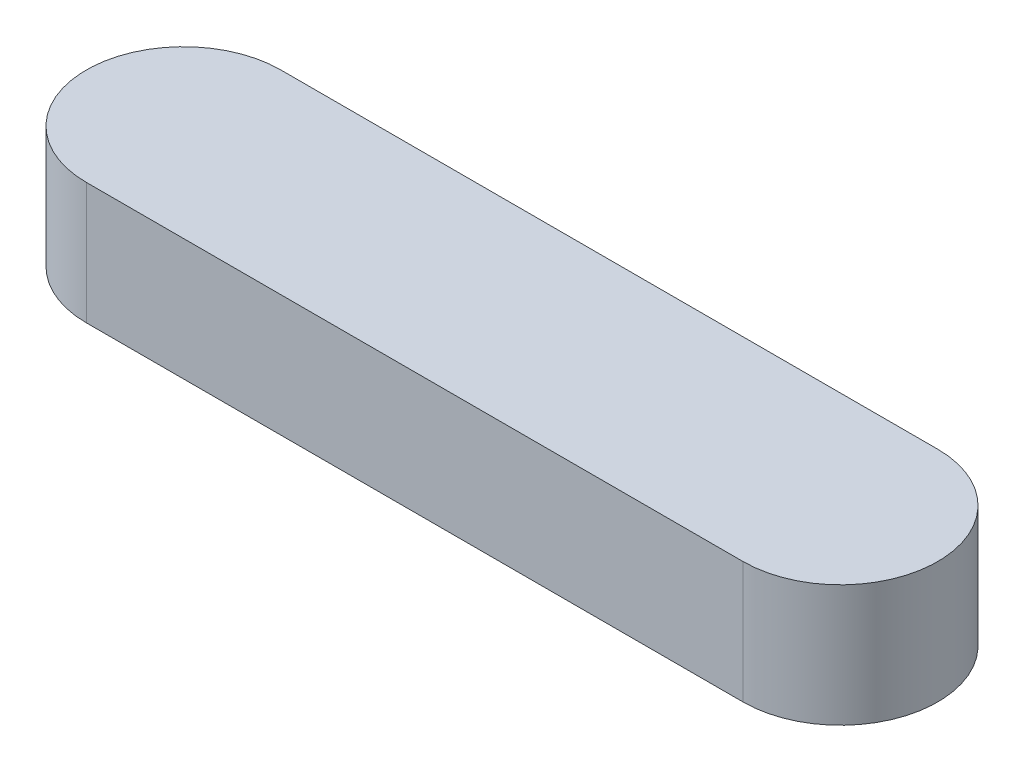
ISO-10303-21;
HEADER;
FILE_DESCRIPTION(('STEP AP214'),'2;1');
FILE_NAME('part.step','',(''),(''),'','','');
FILE_SCHEMA(('AUTOMOTIVE_DESIGN { 1 0 10303 214 1 1 1 1 }'));
ENDSEC;
DATA;
#1=APPLICATION_CONTEXT('core data for automotive mechanical design processes');
#2=APPLICATION_PROTOCOL_DEFINITION('international standard','automotive_design',2000,#1);
#3=PRODUCT_CONTEXT('',#1,'mechanical');
#4=PRODUCT('Part','Part','',(#3));
#5=PRODUCT_RELATED_PRODUCT_CATEGORY('part','',(#4));
#6=PRODUCT_DEFINITION_FORMATION('','',#4);
#7=PRODUCT_DEFINITION_CONTEXT('part definition',#1,'design');
#8=PRODUCT_DEFINITION('design','',#6,#7);
#9=PRODUCT_DEFINITION_SHAPE('','',#8);
#10=(LENGTH_UNIT() NAMED_UNIT(*) SI_UNIT(.MILLI.,.METRE.));
#11=(NAMED_UNIT(*) PLANE_ANGLE_UNIT() SI_UNIT($,.RADIAN.));
#12=(NAMED_UNIT(*) SI_UNIT($,.STERADIAN.) SOLID_ANGLE_UNIT());
#13=UNCERTAINTY_MEASURE_WITH_UNIT(LENGTH_MEASURE(1.E-05),#10,'distance_accuracy_value','');
#14=(GEOMETRIC_REPRESENTATION_CONTEXT(3) GLOBAL_UNCERTAINTY_ASSIGNED_CONTEXT((#13)) GLOBAL_UNIT_ASSIGNED_CONTEXT((#10,
#11,#12)) REPRESENTATION_CONTEXT('',''));
#15=CARTESIAN_POINT('',(0.,0.,0.));
#16=DIRECTION('',(0.,0.,1.));
#17=DIRECTION('',(1.,0.,0.));
#18=AXIS2_PLACEMENT_3D('',#15,#16,#17);
#19=CARTESIAN_POINT('',(-27.0000000000001,81.8052922840653,-3.05311331771918E-13));
#20=DIRECTION('',(0.,-1.,0.));
#21=DIRECTION('',(0.,0.,-1.));
#22=AXIS2_PLACEMENT_3D('',#19,#20,#21);
#23=CYLINDRICAL_SURFACE('',#22,8.);
#24=CARTESIAN_POINT('',(-27.,9.99999999999999,-3.05311331771918E-13));
#25=DIRECTION('',(0.,1.,0.));
#26=DIRECTION('',(0.,0.,1.));
#27=AXIS2_PLACEMENT_3D('',#24,#25,#26);
#28=CIRCLE('',#27,8.);
#29=CARTESIAN_POINT('',(-27.,10.0000000000001,-8.00000000000031));
#30=VERTEX_POINT('',#29);
#31=CARTESIAN_POINT('',(-27.,9.99999999999999,7.99999999999965));
#32=VERTEX_POINT('',#31);
#33=EDGE_CURVE('E94',#30,#32,#28,.T.);
#34=ORIENTED_EDGE('',*,*,#33,.F.);
#35=DIRECTION('',(0.,-1.,0.));
#36=VECTOR('',#35,1.);
#37=CARTESIAN_POINT('',(-27.0000000000001,81.8052922840653,-8.00000000000031));
#38=LINE('',#37,#36);
#39=CARTESIAN_POINT('',(-26.9999999999999,1.52655665885959E-13,-8.00000000000001));
#40=VERTEX_POINT('',#39);
#41=EDGE_CURVE('E48',#30,#40,#38,.T.);
#42=ORIENTED_EDGE('',*,*,#41,.T.);
#43=CARTESIAN_POINT('',(-26.9999999999999,1.52655665885959E-13,0.));
#44=DIRECTION('',(0.,1.,0.));
#45=DIRECTION('',(0.,0.,1.));
#46=AXIS2_PLACEMENT_3D('',#43,#44,#45);
#47=CIRCLE('',#46,8.);
#48=CARTESIAN_POINT('',(-26.9999999999999,0.,7.99999999999995));
#49=VERTEX_POINT('',#48);
#50=EDGE_CURVE('E92',#40,#49,#47,.T.);
#51=ORIENTED_EDGE('',*,*,#50,.T.);
#52=DIRECTION('',(0.,-1.,0.));
#53=VECTOR('',#52,1.);
#54=CARTESIAN_POINT('',(-27.0000000000001,81.8052922840653,7.9999999999997));
#55=LINE('',#54,#53);
#56=EDGE_CURVE('E83',#32,#49,#55,.T.);
#57=ORIENTED_EDGE('',*,*,#56,.F.);
#58=EDGE_LOOP('',(#34,#42,#51,#57));
#59=FACE_BOUND('',#58,.T.);
#60=ADVANCED_FACE('F44',(#59),#23,.T.);
#61=CARTESIAN_POINT('',(-27.0000000000001,81.8052922840653,7.9999999999997));
#62=DIRECTION('',(0.,0.,-1.));
#63=DIRECTION('',(-1.,0.,0.));
#64=AXIS2_PLACEMENT_3D('',#61,#62,#63);
#65=PLANE('',#64);
#66=DIRECTION('',(1.,0.,0.));
#67=VECTOR('',#66,1.);
#68=CARTESIAN_POINT('',(-27.,9.99999999999999,7.99999999999965));
#69=LINE('',#68,#67);
#70=CARTESIAN_POINT('',(26.9999999999999,9.99999999999999,7.99999999999965));
#71=VERTEX_POINT('',#70);
#72=EDGE_CURVE('E53',#32,#71,#69,.T.);
#73=ORIENTED_EDGE('',*,*,#72,.F.);
#74=ORIENTED_EDGE('',*,*,#56,.T.);
#75=DIRECTION('',(1.,0.,0.));
#76=VECTOR('',#75,1.);
#77=CARTESIAN_POINT('',(-26.9999999999999,0.,7.99999999999995));
#78=LINE('',#77,#76);
#79=CARTESIAN_POINT('',(26.9999999999999,0.,7.99999999999995));
#80=VERTEX_POINT('',#79);
#81=EDGE_CURVE('E104',#49,#80,#78,.T.);
#82=ORIENTED_EDGE('',*,*,#81,.T.);
#83=DIRECTION('',(0.,-1.,0.));
#84=VECTOR('',#83,1.);
#85=CARTESIAN_POINT('',(27.0000000000003,81.805292284065,7.9999999999997));
#86=LINE('',#85,#84);
#87=EDGE_CURVE('E113',#71,#80,#86,.T.);
#88=ORIENTED_EDGE('',*,*,#87,.F.);
#89=EDGE_LOOP('',(#73,#74,#82,#88));
#90=FACE_BOUND('',#89,.T.);
#91=ADVANCED_FACE('F117',(#90),#65,.F.);
#92=CARTESIAN_POINT('',(27.0000000000003,81.805292284065,-3.05311331771918E-13));
#93=DIRECTION('',(0.,-1.,0.));
#94=DIRECTION('',(0.,0.,-1.));
#95=AXIS2_PLACEMENT_3D('',#92,#93,#94);
#96=CYLINDRICAL_SURFACE('',#95,8.);
#97=CARTESIAN_POINT('',(26.9999999999999,10.,-3.05311331771918E-13));
#98=DIRECTION('',(0.,1.,0.));
#99=DIRECTION('',(0.,0.,1.));
#100=AXIS2_PLACEMENT_3D('',#97,#98,#99);
#101=CIRCLE('',#100,8.);
#102=CARTESIAN_POINT('',(26.9999999999999,10.0000000000001,-8.00000000000031));
#103=VERTEX_POINT('',#102);
#104=EDGE_CURVE('E13',#71,#103,#101,.T.);
#105=ORIENTED_EDGE('',*,*,#104,.F.);
#106=ORIENTED_EDGE('',*,*,#87,.T.);
#107=CARTESIAN_POINT('',(26.9999999999999,0.,0.));
#108=DIRECTION('',(0.,1.,0.));
#109=DIRECTION('',(0.,0.,1.));
#110=AXIS2_PLACEMENT_3D('',#107,#108,#109);
#111=CIRCLE('',#110,8.);
#112=CARTESIAN_POINT('',(26.9999999999999,1.52655665885959E-13,-8.00000000000001));
#113=VERTEX_POINT('',#112);
#114=EDGE_CURVE('E114',#80,#113,#111,.T.);
#115=ORIENTED_EDGE('',*,*,#114,.T.);
#116=DIRECTION('',(0.,-1.,0.));
#117=VECTOR('',#116,1.);
#118=CARTESIAN_POINT('',(27.0000000000003,81.805292284065,-8.00000000000031));
#119=LINE('',#118,#117);
#120=EDGE_CURVE('E66',#103,#113,#119,.T.);
#121=ORIENTED_EDGE('',*,*,#120,.F.);
#122=EDGE_LOOP('',(#105,#106,#115,#121));
#123=FACE_BOUND('',#122,.T.);
#124=ADVANCED_FACE('F116',(#123),#96,.T.);
#125=CARTESIAN_POINT('',(27.0000000000003,81.805292284065,-8.00000000000031));
#126=DIRECTION('',(0.,0.,1.));
#127=DIRECTION('',(1.,0.,0.));
#128=AXIS2_PLACEMENT_3D('',#125,#126,#127);
#129=PLANE('',#128);
#130=DIRECTION('',(-1.,0.,0.));
#131=VECTOR('',#130,1.);
#132=CARTESIAN_POINT('',(26.9999999999999,10.0000000000001,-8.00000000000031));
#133=LINE('',#132,#131);
#134=EDGE_CURVE('E101',#103,#30,#133,.T.);
#135=ORIENTED_EDGE('',*,*,#134,.F.);
#136=ORIENTED_EDGE('',*,*,#120,.T.);
#137=DIRECTION('',(-1.,0.,0.));
#138=VECTOR('',#137,1.);
#139=CARTESIAN_POINT('',(26.9999999999999,1.52655665885959E-13,-8.00000000000001));
#140=LINE('',#139,#138);
#141=EDGE_CURVE('E97',#113,#40,#140,.T.);
#142=ORIENTED_EDGE('',*,*,#141,.T.);
#143=ORIENTED_EDGE('',*,*,#41,.F.);
#144=EDGE_LOOP('',(#135,#136,#142,#143));
#145=FACE_BOUND('',#144,.T.);
#146=ADVANCED_FACE('F98',(#145),#129,.F.);
#147=CARTESIAN_POINT('',(-26.9999999999999,1.52655665885959E-13,0.));
#148=DIRECTION('',(0.,1.,0.));
#149=DIRECTION('',(0.,0.,1.));
#150=AXIS2_PLACEMENT_3D('',#147,#148,#149);
#151=PLANE('',#150);
#152=ORIENTED_EDGE('',*,*,#50,.F.);
#153=ORIENTED_EDGE('',*,*,#141,.F.);
#154=ORIENTED_EDGE('',*,*,#114,.F.);
#155=ORIENTED_EDGE('',*,*,#81,.F.);
#156=EDGE_LOOP('',(#152,#153,#154,#155));
#157=FACE_BOUND('',#156,.T.);
#158=ADVANCED_FACE('F103',(#157),#151,.F.);
#159=CARTESIAN_POINT('',(0.,9.99999999999999,-3.05311331771918E-13));
#160=DIRECTION('',(0.,1.,0.));
#161=DIRECTION('',(0.,0.,1.));
#162=AXIS2_PLACEMENT_3D('',#159,#160,#161);
#163=PLANE('',#162);
#164=ORIENTED_EDGE('',*,*,#134,.T.);
#165=ORIENTED_EDGE('',*,*,#33,.T.);
#166=ORIENTED_EDGE('',*,*,#72,.T.);
#167=ORIENTED_EDGE('',*,*,#104,.T.);
#168=EDGE_LOOP('',(#164,#165,#166,#167));
#169=FACE_BOUND('',#168,.T.);
#170=ADVANCED_FACE('F46',(#169),#163,.T.);
#171=CLOSED_SHELL('',(#60,#91,#124,#146,#158,#170));
#172=MANIFOLD_SOLID_BREP('B2',#171);
#173=ADVANCED_BREP_SHAPE_REPRESENTATION('',(#18,#172),#14);
#174=SHAPE_DEFINITION_REPRESENTATION(#9,#173);
ENDSEC;
END-ISO-10303-21;
